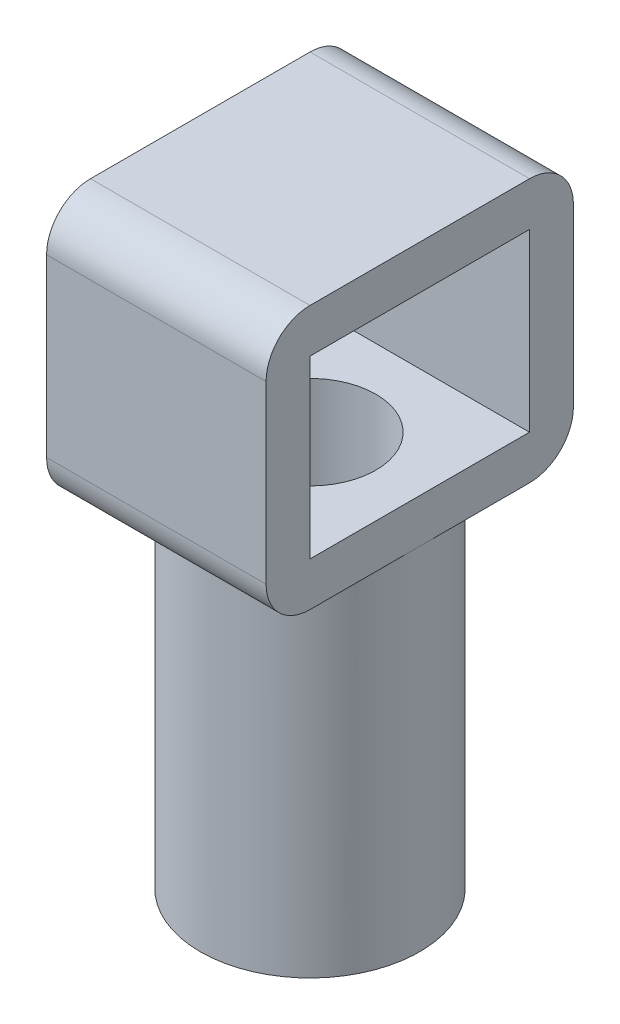
ISO-10303-21;
HEADER;
FILE_DESCRIPTION(('STEP AP214'),'2;1');
FILE_NAME('part.step','',(''),(''),'','','');
FILE_SCHEMA(('AUTOMOTIVE_DESIGN { 1 0 10303 214 1 1 1 1 }'));
ENDSEC;
DATA;
#1=APPLICATION_CONTEXT('core data for automotive mechanical design processes');
#2=APPLICATION_PROTOCOL_DEFINITION('international standard','automotive_design',2000,#1);
#3=PRODUCT_CONTEXT('',#1,'mechanical');
#4=PRODUCT('Part','Part','',(#3));
#5=PRODUCT_RELATED_PRODUCT_CATEGORY('part','',(#4));
#6=PRODUCT_DEFINITION_FORMATION('','',#4);
#7=PRODUCT_DEFINITION_CONTEXT('part definition',#1,'design');
#8=PRODUCT_DEFINITION('design','',#6,#7);
#9=PRODUCT_DEFINITION_SHAPE('','',#8);
#10=(LENGTH_UNIT() NAMED_UNIT(*) SI_UNIT(.MILLI.,.METRE.));
#11=(NAMED_UNIT(*) PLANE_ANGLE_UNIT() SI_UNIT($,.RADIAN.));
#12=(NAMED_UNIT(*) SI_UNIT($,.STERADIAN.) SOLID_ANGLE_UNIT());
#13=UNCERTAINTY_MEASURE_WITH_UNIT(LENGTH_MEASURE(1.E-05),#10,'distance_accuracy_value','');
#14=(GEOMETRIC_REPRESENTATION_CONTEXT(3) GLOBAL_UNCERTAINTY_ASSIGNED_CONTEXT((#13)) GLOBAL_UNIT_ASSIGNED_CONTEXT((#10,
#11,#12)) REPRESENTATION_CONTEXT('',''));
#15=CARTESIAN_POINT('',(0.,0.,0.));
#16=DIRECTION('',(0.,0.,1.));
#17=DIRECTION('',(1.,0.,0.));
#18=AXIS2_PLACEMENT_3D('',#15,#16,#17);
#19=CARTESIAN_POINT('',(0.,40.,0.));
#20=DIRECTION('',(0.,1.,0.));
#21=DIRECTION('',(0.,0.,1.));
#22=AXIS2_PLACEMENT_3D('',#19,#20,#21);
#23=PLANE('',#22);
#24=DIRECTION('',(0.,0.,-1.));
#25=VECTOR('',#24,1.);
#26=CARTESIAN_POINT('',(12.5,40.,17.5));
#27=LINE('',#26,#25);
#28=CARTESIAN_POINT('',(12.5,40.,12.5));
#29=VERTEX_POINT('',#28);
#30=CARTESIAN_POINT('',(12.5,40.,0.));
#31=VERTEX_POINT('',#30);
#32=EDGE_CURVE('E184',#29,#31,#27,.T.);
#33=ORIENTED_EDGE('',*,*,#32,.F.);
#34=DIRECTION('',(1.,0.,0.));
#35=VECTOR('',#34,1.);
#36=CARTESIAN_POINT('',(0.,40.,12.5));
#37=LINE('',#36,#35);
#38=CARTESIAN_POINT('',(0.,40.,12.5));
#39=VERTEX_POINT('',#38);
#40=EDGE_CURVE('E11',#29,#39,#37,.F.);
#41=ORIENTED_EDGE('',*,*,#40,.T.);
#42=CARTESIAN_POINT('',(0.,40.,0.));
#43=DIRECTION('',(0.,1.,0.));
#44=DIRECTION('',(0.,0.,1.));
#45=AXIS2_PLACEMENT_3D('',#42,#43,#44);
#46=CIRCLE('',#45,12.5);
#47=EDGE_CURVE('E211',#39,#31,#46,.T.);
#48=ORIENTED_EDGE('',*,*,#47,.T.);
#49=EDGE_LOOP('',(#33,#41,#48));
#50=FACE_BOUND('',#49,.T.);
#51=ADVANCED_FACE('F33',(#50),#23,.F.);
#52=DIRECTION('',(0.,0.,1.));
#53=VECTOR('',#52,1.);
#54=CARTESIAN_POINT('',(-12.5,40.,17.5));
#55=LINE('',#54,#53);
#56=CARTESIAN_POINT('',(-12.5,40.,-12.5));
#57=VERTEX_POINT('',#56);
#58=CARTESIAN_POINT('',(-12.5,40.,0.));
#59=VERTEX_POINT('',#58);
#60=EDGE_CURVE('E188',#57,#59,#55,.T.);
#61=ORIENTED_EDGE('',*,*,#60,.F.);
#62=DIRECTION('',(-1.,0.,0.));
#63=VECTOR('',#62,1.);
#64=CARTESIAN_POINT('',(0.,40.,-12.5));
#65=LINE('',#64,#63);
#66=CARTESIAN_POINT('',(0.,40.,-12.5));
#67=VERTEX_POINT('',#66);
#68=EDGE_CURVE('E229',#57,#67,#65,.F.);
#69=ORIENTED_EDGE('',*,*,#68,.T.);
#70=EDGE_CURVE('E210',#67,#59,#46,.T.);
#71=ORIENTED_EDGE('',*,*,#70,.T.);
#72=EDGE_LOOP('',(#61,#69,#71));
#73=FACE_BOUND('',#72,.T.);
#74=ADVANCED_FACE('F288',(#73),#23,.F.);
#75=CARTESIAN_POINT('',(0.,40.,0.));
#76=DIRECTION('',(0.,-1.,0.));
#77=DIRECTION('',(0.,0.,-1.));
#78=AXIS2_PLACEMENT_3D('',#75,#76,#77);
#79=CYLINDRICAL_SURFACE('',#78,12.5);
#80=EDGE_CURVE('E206',#31,#67,#46,.T.);
#81=ORIENTED_EDGE('',*,*,#80,.F.);
#82=ORIENTED_EDGE('',*,*,#47,.F.);
#83=EDGE_CURVE('E212',#59,#39,#46,.T.);
#84=ORIENTED_EDGE('',*,*,#83,.F.);
#85=ORIENTED_EDGE('',*,*,#70,.F.);
#86=EDGE_LOOP('',(#81,#82,#84,#85));
#87=FACE_BOUND('',#86,.T.);
#88=CARTESIAN_POINT('',(0.,0.,0.));
#89=DIRECTION('',(0.,1.,0.));
#90=DIRECTION('',(0.,0.,1.));
#91=AXIS2_PLACEMENT_3D('',#88,#89,#90);
#92=CIRCLE('',#91,12.5);
#93=CARTESIAN_POINT('',(0.,0.,12.5));
#94=VERTEX_POINT('',#93);
#95=EDGE_CURVE('E205',#94,#94,#92,.T.);
#96=ORIENTED_EDGE('',*,*,#95,.T.);
#97=EDGE_LOOP('',(#96));
#98=FACE_BOUND('',#97,.T.);
#99=ADVANCED_FACE('F293',(#87,#98),#79,.T.);
#100=CARTESIAN_POINT('',(0.,0.,0.));
#101=DIRECTION('',(0.,1.,0.));
#102=DIRECTION('',(0.,0.,1.));
#103=AXIS2_PLACEMENT_3D('',#100,#101,#102);
#104=PLANE('',#103);
#105=CARTESIAN_POINT('',(0.,0.,0.));
#106=DIRECTION('',(0.,-1.,0.));
#107=DIRECTION('',(0.,0.,-1.));
#108=AXIS2_PLACEMENT_3D('',#105,#106,#107);
#109=CIRCLE('',#108,7.5);
#110=CARTESIAN_POINT('',(0.,0.,-7.5));
#111=VERTEX_POINT('',#110);
#112=EDGE_CURVE('E468',#111,#111,#109,.T.);
#113=ORIENTED_EDGE('',*,*,#112,.F.);
#114=EDGE_LOOP('',(#113));
#115=FACE_BOUND('',#114,.T.);
#116=ORIENTED_EDGE('',*,*,#95,.F.);
#117=EDGE_LOOP('',(#116));
#118=FACE_BOUND('',#117,.T.);
#119=ADVANCED_FACE('F298',(#115,#118),#104,.F.);
#120=ORIENTED_EDGE('',*,*,#80,.T.);
#121=DIRECTION('',(-1.,0.,0.));
#122=VECTOR('',#121,1.);
#123=CARTESIAN_POINT('',(0.,40.,-12.5));
#124=LINE('',#123,#122);
#125=CARTESIAN_POINT('',(12.5,40.,-12.5));
#126=VERTEX_POINT('',#125);
#127=EDGE_CURVE('E227',#67,#126,#124,.F.);
#128=ORIENTED_EDGE('',*,*,#127,.T.);
#129=EDGE_CURVE('E191',#31,#126,#27,.T.);
#130=ORIENTED_EDGE('',*,*,#129,.F.);
#131=EDGE_LOOP('',(#120,#128,#130));
#132=FACE_BOUND('',#131,.T.);
#133=ADVANCED_FACE('F296',(#132),#23,.F.);
#134=ORIENTED_EDGE('',*,*,#83,.T.);
#135=DIRECTION('',(1.,0.,0.));
#136=VECTOR('',#135,1.);
#137=CARTESIAN_POINT('',(0.,40.,12.5));
#138=LINE('',#137,#136);
#139=CARTESIAN_POINT('',(-12.5,40.,12.5));
#140=VERTEX_POINT('',#139);
#141=EDGE_CURVE('E41',#39,#140,#138,.F.);
#142=ORIENTED_EDGE('',*,*,#141,.T.);
#143=EDGE_CURVE('E176',#59,#140,#55,.T.);
#144=ORIENTED_EDGE('',*,*,#143,.F.);
#145=EDGE_LOOP('',(#134,#142,#144));
#146=FACE_BOUND('',#145,.T.);
#147=ADVANCED_FACE('F252',(#146),#23,.F.);
#148=CARTESIAN_POINT('',(-12.5,70.,17.5));
#149=DIRECTION('',(1.,0.,0.));
#150=DIRECTION('',(0.,0.,-1.));
#151=AXIS2_PLACEMENT_3D('',#148,#149,#150);
#152=PLANE('',#151);
#153=DIRECTION('',(0.,0.,-1.));
#154=VECTOR('',#153,1.);
#155=CARTESIAN_POINT('',(-12.5,45.,12.5));
#156=LINE('',#155,#154);
#157=CARTESIAN_POINT('',(-12.5,45.,12.5));
#158=VERTEX_POINT('',#157);
#159=CARTESIAN_POINT('',(-12.5,45.,-12.5));
#160=VERTEX_POINT('',#159);
#161=EDGE_CURVE('E145',#158,#160,#156,.T.);
#162=ORIENTED_EDGE('',*,*,#161,.T.);
#163=DIRECTION('',(0.,1.,0.));
#164=VECTOR('',#163,1.);
#165=CARTESIAN_POINT('',(-12.5,45.,-12.5));
#166=LINE('',#165,#164);
#167=CARTESIAN_POINT('',(-12.5,65.,-12.5));
#168=VERTEX_POINT('',#167);
#169=EDGE_CURVE('E137',#160,#168,#166,.T.);
#170=ORIENTED_EDGE('',*,*,#169,.T.);
#171=DIRECTION('',(0.,0.,1.));
#172=VECTOR('',#171,1.);
#173=CARTESIAN_POINT('',(-12.5,65.,12.5));
#174=LINE('',#173,#172);
#175=CARTESIAN_POINT('',(-12.5,65.,12.5));
#176=VERTEX_POINT('',#175);
#177=EDGE_CURVE('E149',#168,#176,#174,.T.);
#178=ORIENTED_EDGE('',*,*,#177,.T.);
#179=DIRECTION('',(0.,-1.,0.));
#180=VECTOR('',#179,1.);
#181=CARTESIAN_POINT('',(-12.5,45.,12.5));
#182=LINE('',#181,#180);
#183=EDGE_CURVE('E153',#176,#158,#182,.T.);
#184=ORIENTED_EDGE('',*,*,#183,.T.);
#185=EDGE_LOOP('',(#162,#170,#178,#184));
#186=FACE_BOUND('',#185,.T.);
#187=DIRECTION('',(0.,-1.,0.));
#188=VECTOR('',#187,1.);
#189=CARTESIAN_POINT('',(-12.5,70.,-17.5));
#190=LINE('',#189,#188);
#191=CARTESIAN_POINT('',(-12.5,65.,-17.5));
#192=VERTEX_POINT('',#191);
#193=CARTESIAN_POINT('',(-12.5,45.,-17.5));
#194=VERTEX_POINT('',#193);
#195=EDGE_CURVE('E187',#192,#194,#190,.T.);
#196=ORIENTED_EDGE('',*,*,#195,.T.);
#197=CARTESIAN_POINT('',(-12.5,45.,-12.5));
#198=DIRECTION('',(1.,0.,0.));
#199=DIRECTION('',(0.,0.,-1.));
#200=AXIS2_PLACEMENT_3D('',#197,#198,#199);
#201=CIRCLE('',#200,5.);
#202=EDGE_CURVE('E225',#194,#57,#201,.F.);
#203=ORIENTED_EDGE('',*,*,#202,.T.);
#204=ORIENTED_EDGE('',*,*,#60,.T.);
#205=ORIENTED_EDGE('',*,*,#143,.T.);
#206=CARTESIAN_POINT('',(-12.5,45.,12.5));
#207=DIRECTION('',(1.,0.,0.));
#208=DIRECTION('',(0.,0.,-1.));
#209=AXIS2_PLACEMENT_3D('',#206,#207,#208);
#210=CIRCLE('',#209,5.);
#211=CARTESIAN_POINT('',(-12.5,45.,17.5));
#212=VERTEX_POINT('',#211);
#213=EDGE_CURVE('E219',#140,#212,#210,.F.);
#214=ORIENTED_EDGE('',*,*,#213,.T.);
#215=DIRECTION('',(0.,-1.,0.));
#216=VECTOR('',#215,1.);
#217=CARTESIAN_POINT('',(-12.5,70.,17.5));
#218=LINE('',#217,#216);
#219=CARTESIAN_POINT('',(-12.5,65.,17.5));
#220=VERTEX_POINT('',#219);
#221=EDGE_CURVE('E202',#220,#212,#218,.T.);
#222=ORIENTED_EDGE('',*,*,#221,.F.);
#223=CARTESIAN_POINT('',(-12.5,65.,12.5));
#224=DIRECTION('',(1.,0.,0.));
#225=DIRECTION('',(0.,0.,-1.));
#226=AXIS2_PLACEMENT_3D('',#223,#224,#225);
#227=CIRCLE('',#226,5.);
#228=CARTESIAN_POINT('',(-12.5,70.,12.5));
#229=VERTEX_POINT('',#228);
#230=EDGE_CURVE('E221',#220,#229,#227,.F.);
#231=ORIENTED_EDGE('',*,*,#230,.T.);
#232=DIRECTION('',(0.,0.,1.));
#233=VECTOR('',#232,1.);
#234=CARTESIAN_POINT('',(-12.5,70.,17.5));
#235=LINE('',#234,#233);
#236=CARTESIAN_POINT('',(-12.5,70.,-12.5));
#237=VERTEX_POINT('',#236);
#238=EDGE_CURVE('E180',#237,#229,#235,.T.);
#239=ORIENTED_EDGE('',*,*,#238,.F.);
#240=CARTESIAN_POINT('',(-12.5,65.,-12.5));
#241=DIRECTION('',(1.,0.,0.));
#242=DIRECTION('',(0.,0.,-1.));
#243=AXIS2_PLACEMENT_3D('',#240,#241,#242);
#244=CIRCLE('',#243,5.);
#245=EDGE_CURVE('E223',#237,#192,#244,.F.);
#246=ORIENTED_EDGE('',*,*,#245,.T.);
#247=EDGE_LOOP('',(#196,#203,#204,#205,#214,#222,#231,#239,#246));
#248=FACE_BOUND('',#247,.T.);
#249=ADVANCED_FACE('F155',(#186,#248),#152,.F.);
#250=CARTESIAN_POINT('',(12.5,70.,17.5));
#251=DIRECTION('',(0.,0.,-1.));
#252=DIRECTION('',(-1.,0.,0.));
#253=AXIS2_PLACEMENT_3D('',#250,#251,#252);
#254=PLANE('',#253);
#255=DIRECTION('',(0.,-1.,0.));
#256=VECTOR('',#255,1.);
#257=CARTESIAN_POINT('',(12.5,70.,17.5));
#258=LINE('',#257,#256);
#259=CARTESIAN_POINT('',(12.5,65.,17.5));
#260=VERTEX_POINT('',#259);
#261=CARTESIAN_POINT('',(12.5,45.,17.5));
#262=VERTEX_POINT('',#261);
#263=EDGE_CURVE('E199',#260,#262,#258,.T.);
#264=ORIENTED_EDGE('',*,*,#263,.F.);
#265=DIRECTION('',(1.,0.,0.));
#266=VECTOR('',#265,1.);
#267=CARTESIAN_POINT('',(-12.5,65.,17.5));
#268=LINE('',#267,#266);
#269=EDGE_CURVE('E246',#260,#220,#268,.F.);
#270=ORIENTED_EDGE('',*,*,#269,.T.);
#271=ORIENTED_EDGE('',*,*,#221,.T.);
#272=DIRECTION('',(1.,0.,0.));
#273=VECTOR('',#272,1.);
#274=CARTESIAN_POINT('',(12.5,45.,17.5));
#275=LINE('',#274,#273);
#276=EDGE_CURVE('E244',#212,#262,#275,.T.);
#277=ORIENTED_EDGE('',*,*,#276,.T.);
#278=EDGE_LOOP('',(#264,#270,#271,#277));
#279=FACE_BOUND('',#278,.T.);
#280=ADVANCED_FACE('F259',(#279),#254,.F.);
#281=CARTESIAN_POINT('',(12.5,70.,17.5));
#282=DIRECTION('',(-1.,0.,0.));
#283=DIRECTION('',(0.,0.,1.));
#284=AXIS2_PLACEMENT_3D('',#281,#282,#283);
#285=PLANE('',#284);
#286=DIRECTION('',(0.,0.,1.));
#287=VECTOR('',#286,1.);
#288=CARTESIAN_POINT('',(12.5,65.,12.5));
#289=LINE('',#288,#287);
#290=CARTESIAN_POINT('',(12.5,65.,-12.5));
#291=VERTEX_POINT('',#290);
#292=CARTESIAN_POINT('',(12.5,65.,12.5));
#293=VERTEX_POINT('',#292);
#294=EDGE_CURVE('E170',#291,#293,#289,.T.);
#295=ORIENTED_EDGE('',*,*,#294,.F.);
#296=DIRECTION('',(0.,1.,0.));
#297=VECTOR('',#296,1.);
#298=CARTESIAN_POINT('',(12.5,45.,-12.5));
#299=LINE('',#298,#297);
#300=CARTESIAN_POINT('',(12.5,45.,-12.5));
#301=VERTEX_POINT('',#300);
#302=EDGE_CURVE('E140',#301,#291,#299,.T.);
#303=ORIENTED_EDGE('',*,*,#302,.F.);
#304=DIRECTION('',(0.,0.,-1.));
#305=VECTOR('',#304,1.);
#306=CARTESIAN_POINT('',(12.5,45.,12.5));
#307=LINE('',#306,#305);
#308=CARTESIAN_POINT('',(12.5,45.,12.5));
#309=VERTEX_POINT('',#308);
#310=EDGE_CURVE('E158',#309,#301,#307,.T.);
#311=ORIENTED_EDGE('',*,*,#310,.F.);
#312=DIRECTION('',(0.,-1.,0.));
#313=VECTOR('',#312,1.);
#314=CARTESIAN_POINT('',(12.5,45.,12.5));
#315=LINE('',#314,#313);
#316=EDGE_CURVE('E161',#293,#309,#315,.T.);
#317=ORIENTED_EDGE('',*,*,#316,.F.);
#318=EDGE_LOOP('',(#295,#303,#311,#317));
#319=FACE_BOUND('',#318,.T.);
#320=ORIENTED_EDGE('',*,*,#129,.T.);
#321=CARTESIAN_POINT('',(12.5,45.,-12.5));
#322=DIRECTION('',(-1.,0.,0.));
#323=DIRECTION('',(0.,0.,1.));
#324=AXIS2_PLACEMENT_3D('',#321,#322,#323);
#325=CIRCLE('',#324,5.);
#326=CARTESIAN_POINT('',(12.5,45.,-17.5));
#327=VERTEX_POINT('',#326);
#328=EDGE_CURVE('E236',#126,#327,#325,.F.);
#329=ORIENTED_EDGE('',*,*,#328,.T.);
#330=DIRECTION('',(0.,-1.,0.));
#331=VECTOR('',#330,1.);
#332=CARTESIAN_POINT('',(12.5,70.,-17.5));
#333=LINE('',#332,#331);
#334=CARTESIAN_POINT('',(12.5,65.,-17.5));
#335=VERTEX_POINT('',#334);
#336=EDGE_CURVE('E196',#335,#327,#333,.T.);
#337=ORIENTED_EDGE('',*,*,#336,.F.);
#338=CARTESIAN_POINT('',(12.5,65.,-12.5));
#339=DIRECTION('',(-1.,0.,0.));
#340=DIRECTION('',(0.,0.,1.));
#341=AXIS2_PLACEMENT_3D('',#338,#339,#340);
#342=CIRCLE('',#341,5.);
#343=CARTESIAN_POINT('',(12.5,70.,-12.5));
#344=VERTEX_POINT('',#343);
#345=EDGE_CURVE('E234',#335,#344,#342,.F.);
#346=ORIENTED_EDGE('',*,*,#345,.T.);
#347=DIRECTION('',(0.,0.,-1.));
#348=VECTOR('',#347,1.);
#349=CARTESIAN_POINT('',(12.5,70.,17.5));
#350=LINE('',#349,#348);
#351=CARTESIAN_POINT('',(12.5,70.,12.5));
#352=VERTEX_POINT('',#351);
#353=EDGE_CURVE('E183',#352,#344,#350,.T.);
#354=ORIENTED_EDGE('',*,*,#353,.F.);
#355=CARTESIAN_POINT('',(12.5,65.,12.5));
#356=DIRECTION('',(-1.,0.,0.));
#357=DIRECTION('',(0.,0.,1.));
#358=AXIS2_PLACEMENT_3D('',#355,#356,#357);
#359=CIRCLE('',#358,5.);
#360=EDGE_CURVE('E232',#352,#260,#359,.F.);
#361=ORIENTED_EDGE('',*,*,#360,.T.);
#362=ORIENTED_EDGE('',*,*,#263,.T.);
#363=CARTESIAN_POINT('',(12.5,45.,12.5));
#364=DIRECTION('',(-1.,0.,0.));
#365=DIRECTION('',(0.,0.,1.));
#366=AXIS2_PLACEMENT_3D('',#363,#364,#365);
#367=CIRCLE('',#366,5.);
#368=EDGE_CURVE('E53',#262,#29,#367,.F.);
#369=ORIENTED_EDGE('',*,*,#368,.T.);
#370=ORIENTED_EDGE('',*,*,#32,.T.);
#371=EDGE_LOOP('',(#320,#329,#337,#346,#354,#361,#362,#369,#370));
#372=FACE_BOUND('',#371,.T.);
#373=ADVANCED_FACE('F263',(#319,#372),#285,.F.);
#374=CARTESIAN_POINT('',(12.5,70.,-17.5));
#375=DIRECTION('',(0.,0.,1.));
#376=DIRECTION('',(1.,0.,0.));
#377=AXIS2_PLACEMENT_3D('',#374,#375,#376);
#378=PLANE('',#377);
#379=ORIENTED_EDGE('',*,*,#336,.T.);
#380=DIRECTION('',(-1.,0.,0.));
#381=VECTOR('',#380,1.);
#382=CARTESIAN_POINT('',(12.5,45.,-17.5));
#383=LINE('',#382,#381);
#384=EDGE_CURVE('E216',#327,#194,#383,.T.);
#385=ORIENTED_EDGE('',*,*,#384,.T.);
#386=ORIENTED_EDGE('',*,*,#195,.F.);
#387=DIRECTION('',(-1.,0.,0.));
#388=VECTOR('',#387,1.);
#389=CARTESIAN_POINT('',(12.5,65.,-17.5));
#390=LINE('',#389,#388);
#391=EDGE_CURVE('E209',#192,#335,#390,.F.);
#392=ORIENTED_EDGE('',*,*,#391,.T.);
#393=EDGE_LOOP('',(#379,#385,#386,#392));
#394=FACE_BOUND('',#393,.T.);
#395=ADVANCED_FACE('F277',(#394),#378,.F.);
#396=CARTESIAN_POINT('',(0.,70.,0.));
#397=DIRECTION('',(0.,1.,0.));
#398=DIRECTION('',(0.,0.,1.));
#399=AXIS2_PLACEMENT_3D('',#396,#397,#398);
#400=PLANE('',#399);
#401=ORIENTED_EDGE('',*,*,#353,.T.);
#402=DIRECTION('',(-1.,0.,0.));
#403=VECTOR('',#402,1.);
#404=CARTESIAN_POINT('',(-12.5,70.,-12.5));
#405=LINE('',#404,#403);
#406=EDGE_CURVE('E241',#344,#237,#405,.T.);
#407=ORIENTED_EDGE('',*,*,#406,.T.);
#408=ORIENTED_EDGE('',*,*,#238,.T.);
#409=DIRECTION('',(1.,0.,0.));
#410=VECTOR('',#409,1.);
#411=CARTESIAN_POINT('',(12.5,70.,12.5));
#412=LINE('',#411,#410);
#413=EDGE_CURVE('E238',#229,#352,#412,.T.);
#414=ORIENTED_EDGE('',*,*,#413,.T.);
#415=EDGE_LOOP('',(#401,#407,#408,#414));
#416=FACE_BOUND('',#415,.T.);
#417=ADVANCED_FACE('F270',(#416),#400,.T.);
#418=CARTESIAN_POINT('',(-12.5,45.,-12.5));
#419=DIRECTION('',(0.,0.,-1.));
#420=DIRECTION('',(-1.,0.,0.));
#421=AXIS2_PLACEMENT_3D('',#418,#419,#420);
#422=PLANE('',#421);
#423=ORIENTED_EDGE('',*,*,#302,.T.);
#424=DIRECTION('',(1.,0.,0.));
#425=VECTOR('',#424,1.);
#426=CARTESIAN_POINT('',(-12.5,65.,-12.5));
#427=LINE('',#426,#425);
#428=EDGE_CURVE('E133',#168,#291,#427,.T.);
#429=ORIENTED_EDGE('',*,*,#428,.F.);
#430=ORIENTED_EDGE('',*,*,#169,.F.);
#431=DIRECTION('',(1.,0.,0.));
#432=VECTOR('',#431,1.);
#433=CARTESIAN_POINT('',(-12.5,45.,-12.5));
#434=LINE('',#433,#432);
#435=EDGE_CURVE('E174',#160,#301,#434,.T.);
#436=ORIENTED_EDGE('',*,*,#435,.T.);
#437=EDGE_LOOP('',(#423,#429,#430,#436));
#438=FACE_BOUND('',#437,.T.);
#439=ADVANCED_FACE('F135',(#438),#422,.F.);
#440=CARTESIAN_POINT('',(-12.5,45.,12.5));
#441=DIRECTION('',(0.,-1.,0.));
#442=DIRECTION('',(0.,0.,-1.));
#443=AXIS2_PLACEMENT_3D('',#440,#441,#442);
#444=PLANE('',#443);
#445=CARTESIAN_POINT('',(0.,45.,0.));
#446=DIRECTION('',(0.,-1.,0.));
#447=DIRECTION('',(0.,0.,-1.));
#448=AXIS2_PLACEMENT_3D('',#445,#446,#447);
#449=CIRCLE('',#448,7.5);
#450=CARTESIAN_POINT('',(0.,45.,-7.5));
#451=VERTEX_POINT('',#450);
#452=EDGE_CURVE('E164',#451,#451,#449,.T.);
#453=ORIENTED_EDGE('',*,*,#452,.T.);
#454=EDGE_LOOP('',(#453));
#455=FACE_BOUND('',#454,.T.);
#456=ORIENTED_EDGE('',*,*,#310,.T.);
#457=ORIENTED_EDGE('',*,*,#435,.F.);
#458=ORIENTED_EDGE('',*,*,#161,.F.);
#459=DIRECTION('',(1.,0.,0.));
#460=VECTOR('',#459,1.);
#461=CARTESIAN_POINT('',(-12.5,45.,12.5));
#462=LINE('',#461,#460);
#463=EDGE_CURVE('E177',#158,#309,#462,.T.);
#464=ORIENTED_EDGE('',*,*,#463,.T.);
#465=EDGE_LOOP('',(#456,#457,#458,#464));
#466=FACE_BOUND('',#465,.T.);
#467=ADVANCED_FACE('F338',(#455,#466),#444,.F.);
#468=CARTESIAN_POINT('',(-12.5,45.,12.5));
#469=DIRECTION('',(0.,0.,1.));
#470=DIRECTION('',(1.,0.,0.));
#471=AXIS2_PLACEMENT_3D('',#468,#469,#470);
#472=PLANE('',#471);
#473=ORIENTED_EDGE('',*,*,#316,.T.);
#474=ORIENTED_EDGE('',*,*,#463,.F.);
#475=ORIENTED_EDGE('',*,*,#183,.F.);
#476=DIRECTION('',(1.,0.,0.));
#477=VECTOR('',#476,1.);
#478=CARTESIAN_POINT('',(-12.5,65.,12.5));
#479=LINE('',#478,#477);
#480=EDGE_CURVE('E144',#176,#293,#479,.T.);
#481=ORIENTED_EDGE('',*,*,#480,.T.);
#482=EDGE_LOOP('',(#473,#474,#475,#481));
#483=FACE_BOUND('',#482,.T.);
#484=ADVANCED_FACE('F341',(#483),#472,.F.);
#485=CARTESIAN_POINT('',(-12.5,65.,12.5));
#486=DIRECTION('',(0.,1.,0.));
#487=DIRECTION('',(0.,0.,1.));
#488=AXIS2_PLACEMENT_3D('',#485,#486,#487);
#489=PLANE('',#488);
#490=ORIENTED_EDGE('',*,*,#294,.T.);
#491=ORIENTED_EDGE('',*,*,#480,.F.);
#492=ORIENTED_EDGE('',*,*,#177,.F.);
#493=ORIENTED_EDGE('',*,*,#428,.T.);
#494=EDGE_LOOP('',(#490,#491,#492,#493));
#495=FACE_BOUND('',#494,.T.);
#496=ADVANCED_FACE('F150',(#495),#489,.F.);
#497=CARTESIAN_POINT('',(12.5,45.,-12.5));
#498=DIRECTION('',(-1.,0.,0.));
#499=DIRECTION('',(0.,0.,1.));
#500=AXIS2_PLACEMENT_3D('',#497,#498,#499);
#501=CYLINDRICAL_SURFACE('',#500,5.);
#502=ORIENTED_EDGE('',*,*,#127,.F.);
#503=ORIENTED_EDGE('',*,*,#68,.F.);
#504=ORIENTED_EDGE('',*,*,#202,.F.);
#505=ORIENTED_EDGE('',*,*,#384,.F.);
#506=ORIENTED_EDGE('',*,*,#328,.F.);
#507=EDGE_LOOP('',(#502,#503,#504,#505,#506));
#508=FACE_BOUND('',#507,.T.);
#509=ADVANCED_FACE('F285',(#508),#501,.T.);
#510=CARTESIAN_POINT('',(0.,65.,-12.5));
#511=DIRECTION('',(1.,0.,0.));
#512=DIRECTION('',(0.,0.,-1.));
#513=AXIS2_PLACEMENT_3D('',#510,#511,#512);
#514=CYLINDRICAL_SURFACE('',#513,5.);
#515=ORIENTED_EDGE('',*,*,#345,.F.);
#516=ORIENTED_EDGE('',*,*,#391,.F.);
#517=ORIENTED_EDGE('',*,*,#245,.F.);
#518=ORIENTED_EDGE('',*,*,#406,.F.);
#519=EDGE_LOOP('',(#515,#516,#517,#518));
#520=FACE_BOUND('',#519,.T.);
#521=ADVANCED_FACE('F281',(#520),#514,.T.);
#522=CARTESIAN_POINT('',(0.,65.,12.5));
#523=DIRECTION('',(-1.,0.,0.));
#524=DIRECTION('',(0.,0.,1.));
#525=AXIS2_PLACEMENT_3D('',#522,#523,#524);
#526=CYLINDRICAL_SURFACE('',#525,5.);
#527=ORIENTED_EDGE('',*,*,#230,.F.);
#528=ORIENTED_EDGE('',*,*,#269,.F.);
#529=ORIENTED_EDGE('',*,*,#360,.F.);
#530=ORIENTED_EDGE('',*,*,#413,.F.);
#531=EDGE_LOOP('',(#527,#528,#529,#530));
#532=FACE_BOUND('',#531,.T.);
#533=ADVANCED_FACE('F268',(#532),#526,.T.);
#534=CARTESIAN_POINT('',(12.5,45.,12.5));
#535=DIRECTION('',(1.,0.,0.));
#536=DIRECTION('',(0.,0.,-1.));
#537=AXIS2_PLACEMENT_3D('',#534,#535,#536);
#538=CYLINDRICAL_SURFACE('',#537,5.);
#539=ORIENTED_EDGE('',*,*,#141,.F.);
#540=ORIENTED_EDGE('',*,*,#40,.F.);
#541=ORIENTED_EDGE('',*,*,#368,.F.);
#542=ORIENTED_EDGE('',*,*,#276,.F.);
#543=ORIENTED_EDGE('',*,*,#213,.F.);
#544=EDGE_LOOP('',(#539,#540,#541,#542,#543));
#545=FACE_BOUND('',#544,.T.);
#546=ADVANCED_FACE('F35',(#545),#538,.T.);
#547=CARTESIAN_POINT('',(0.,65.,0.));
#548=DIRECTION('',(0.,-1.,0.));
#549=DIRECTION('',(0.,0.,-1.));
#550=AXIS2_PLACEMENT_3D('',#547,#548,#549);
#551=CYLINDRICAL_SURFACE('',#550,7.5);
#552=ORIENTED_EDGE('',*,*,#112,.T.);
#553=EDGE_LOOP('',(#552));
#554=FACE_BOUND('',#553,.T.);
#555=ORIENTED_EDGE('',*,*,#452,.F.);
#556=EDGE_LOOP('',(#555));
#557=FACE_BOUND('',#556,.T.);
#558=ADVANCED_FACE('F327',(#554,#557),#551,.F.);
#559=CLOSED_SHELL('',(#51,#74,#99,#119,#133,#147,#249,#280,#373,#395,#417,#439,#467,#484,#496,
#509,#521,#533,#546,#558));
#560=MANIFOLD_SOLID_BREP('B2',#559);
#561=ADVANCED_BREP_SHAPE_REPRESENTATION('',(#18,#560),#14);
#562=SHAPE_DEFINITION_REPRESENTATION(#9,#561);
ENDSEC;
END-ISO-10303-21;
